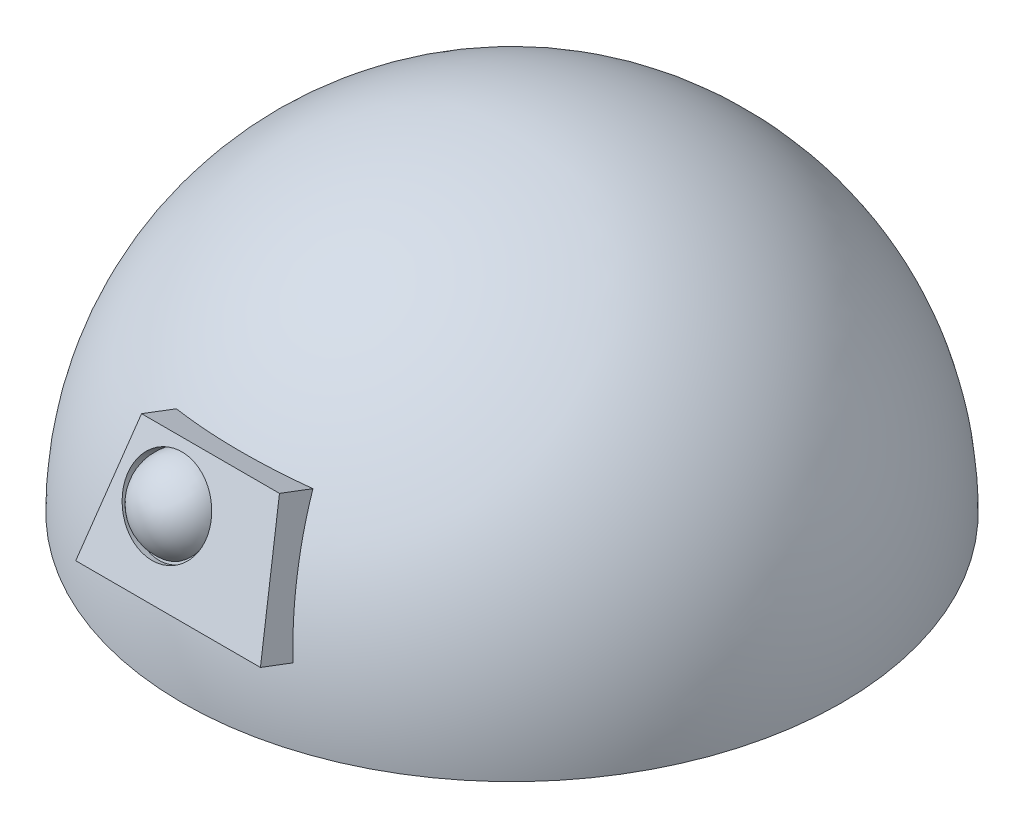
ISO-10303-21;
HEADER;
FILE_DESCRIPTION(('STEP AP214'),'2;1');
FILE_NAME('part.step','',(''),(''),'','','');
FILE_SCHEMA(('AUTOMOTIVE_DESIGN { 1 0 10303 214 1 1 1 1 }'));
ENDSEC;
DATA;
#1=APPLICATION_CONTEXT('core data for automotive mechanical design processes');
#2=APPLICATION_PROTOCOL_DEFINITION('international standard','automotive_design',2000,#1);
#3=PRODUCT_CONTEXT('',#1,'mechanical');
#4=PRODUCT('Part','Part','',(#3));
#5=PRODUCT_RELATED_PRODUCT_CATEGORY('part','',(#4));
#6=PRODUCT_DEFINITION_FORMATION('','',#4);
#7=PRODUCT_DEFINITION_CONTEXT('part definition',#1,'design');
#8=PRODUCT_DEFINITION('design','',#6,#7);
#9=PRODUCT_DEFINITION_SHAPE('','',#8);
#10=(LENGTH_UNIT() NAMED_UNIT(*) SI_UNIT(.MILLI.,.METRE.));
#11=(NAMED_UNIT(*) PLANE_ANGLE_UNIT() SI_UNIT($,.RADIAN.));
#12=(NAMED_UNIT(*) SI_UNIT($,.STERADIAN.) SOLID_ANGLE_UNIT());
#13=UNCERTAINTY_MEASURE_WITH_UNIT(LENGTH_MEASURE(1.E-05),#10,'distance_accuracy_value','');
#14=(GEOMETRIC_REPRESENTATION_CONTEXT(3) GLOBAL_UNCERTAINTY_ASSIGNED_CONTEXT((#13)) GLOBAL_UNIT_ASSIGNED_CONTEXT((#10,
#11,#12)) REPRESENTATION_CONTEXT('',''));
#15=CARTESIAN_POINT('',(0.,0.,0.));
#16=DIRECTION('',(0.,0.,1.));
#17=DIRECTION('',(1.,0.,0.));
#18=AXIS2_PLACEMENT_3D('',#15,#16,#17);
#19=CARTESIAN_POINT('',(93.2238359222801,259.835287103337,172.836450809138));
#20=DIRECTION('',(-0.468579118998303,0.826360704640854,-0.312348515386651));
#21=DIRECTION('',(0.883421102676732,0.438663000991985,-0.164748071024012));
#22=AXIS2_PLACEMENT_3D('',#19,#20,#21);
#23=SPHERICAL_SURFACE('',#22,11.3046302669509);
#24=CARTESIAN_POINT('',(93.2238359222801,259.835287103337,172.836450809138));
#25=DIRECTION('',(0.000874405055275862,-0.353132775859417,-0.935572807444521));
#26=DIRECTION('',(0.827905680495407,-0.524476362863778,0.198737839881135));
#27=AXIS2_PLACEMENT_3D('',#24,#25,#26);
#28=SPHERICAL_SURFACE('',#27,11.3046302669509);
#29=CARTESIAN_POINT('',(93.2238359222801,259.835287103337,172.836450809138));
#30=DIRECTION('',(0.000874405055275862,-0.353132775859417,-0.935572807444521));
#31=DIRECTION('',(0.827905680495407,-0.524476362863778,0.198737839881135));
#32=AXIS2_PLACEMENT_3D('',#29,#30,#31);
#33=CIRCLE('',#32,11.3046302669509);
#34=CARTESIAN_POINT('',(102.583003536189,253.906275737407,175.083108609046));
#35=VERTEX_POINT('',#34);
#36=EDGE_CURVE('E12',#35,#35,#33,.T.);
#37=ORIENTED_EDGE('',*,*,#36,.F.);
#38=EDGE_LOOP('',(#37));
#39=FACE_BOUND('',#38,.T.);
#40=ADVANCED_FACE('F43',(#39),#28,.T.);
#41=CARTESIAN_POINT('',(93.2238359222801,259.835287103337,172.836450809138));
#42=DIRECTION('',(0.000874405055275862,-0.353132775859417,-0.935572807444521));
#43=DIRECTION('',(0.827905680495407,-0.524476362863778,0.198737839881135));
#44=AXIS2_PLACEMENT_3D('',#41,#42,#43);
#45=PLANE('',#44);
#46=ORIENTED_EDGE('',*,*,#36,.T.);
#47=EDGE_LOOP('',(#46));
#48=FACE_BOUND('',#47,.T.);
#49=ADVANCED_FACE('F50',(#48),#45,.T.);
#50=CLOSED_SHELL('',(#40,#49));
#51=MANIFOLD_SOLID_BREP('B2',#50);
#52=CARTESIAN_POINT('',(100.909927582886,221.719877511256,93.0506266256161));
#53=DIRECTION('',(0.00253055097969708,0.,-0.999996798150744));
#54=DIRECTION('',(-0.999996798150744,0.,-0.00253055097969708));
#55=AXIS2_PLACEMENT_3D('',#52,#53,#54);
#56=SPHERICAL_SURFACE('',#55,88.1119686753254);
#57=CARTESIAN_POINT('',(78.4925954001065,225.411072234313,91.6364302564517));
#58=DIRECTION('',(-0.984807376527911,0.16215648507274,-0.0621265280300407));
#59=DIRECTION('',(-0.16247033202055,-0.986713429123741,0.));
#60=AXIS2_PLACEMENT_3D('',#57,#58,#59);
#61=CIRCLE('',#60,85.1208398207771);
#62=CARTESIAN_POINT('',(75.6448384490089,240.212805467445,175.412061232512));
#63=VERTEX_POINT('',#62);
#64=CARTESIAN_POINT('',(81.5058743394977,271.182905571055,163.3401037664));
#65=VERTEX_POINT('',#64);
#66=EDGE_CURVE('E91',#63,#65,#61,.T.);
#67=ORIENTED_EDGE('',*,*,#66,.T.);
#68=CARTESIAN_POINT('',(100.909927582886,241.792369666429,85.4742468754032));
#69=DIRECTION('',(0.,0.935573165106818,-0.353132910859368));
#70=DIRECTION('',(0.,0.353132910859368,0.935573165106819));
#71=AXIS2_PLACEMENT_3D('',#68,#69,#70);
#72=CIRCLE('',#71,85.4600055722127);
#73=CARTESIAN_POINT('',(118.39746546765,271.332520378528,163.736485963216));
#74=VERTEX_POINT('',#73);
#75=EDGE_CURVE('E129',#65,#74,#72,.T.);
#76=ORIENTED_EDGE('',*,*,#75,.T.);
#77=CARTESIAN_POINT('',(121.923567848481,225.662195528681,91.5822350043501));
#78=DIRECTION('',(0.980543180600844,0.18395732480842,-0.0685184181553335));
#79=DIRECTION('',(-0.1843906702493,0.982853031091126,0.));
#80=AXIS2_PLACEMENT_3D('',#77,#78,#79);
#81=CIRCLE('',#80,85.4660628631374);
#82=CARTESIAN_POINT('',(125.051335900975,240.329847948912,175.722147892437));
#83=VERTEX_POINT('',#82);
#84=EDGE_CURVE('E160',#74,#83,#81,.T.);
#85=ORIENTED_EDGE('',*,*,#84,.T.);
#86=CARTESIAN_POINT('',(100.909927582886,210.695975865551,97.2116079602303));
#87=DIRECTION('',(0.,-0.935573165106818,0.353132910859368));
#88=DIRECTION('',(0.,-0.353132910859368,-0.935573165106819));
#89=AXIS2_PLACEMENT_3D('',#86,#87,#88);
#90=CIRCLE('',#89,87.320552281123);
#91=EDGE_CURVE('E87',#83,#63,#90,.T.);
#92=ORIENTED_EDGE('',*,*,#91,.T.);
#93=EDGE_LOOP('',(#67,#76,#85,#92));
#94=FACE_BOUND('',#93,.T.);
#95=CARTESIAN_POINT('',(100.909927582886,221.719877511256,93.0506266256161));
#96=DIRECTION('',(0.,1.,0.));
#97=DIRECTION('',(0.00506108575450862,0.,-0.999987192623478));
#98=AXIS2_PLACEMENT_3D('',#95,#96,#97);
#99=CIRCLE('',#98,88.1119686753254);
#100=CARTESIAN_POINT('',(101.35586981235,221.719877511256,4.93978643344956));
#101=VERTEX_POINT('',#100);
#102=EDGE_CURVE('E41',#101,#101,#99,.T.);
#103=ORIENTED_EDGE('',*,*,#102,.T.);
#104=EDGE_LOOP('',(#103));
#105=FACE_BOUND('',#104,.T.);
#106=ADVANCED_FACE('F73',(#94,#105),#56,.T.);
#107=CARTESIAN_POINT('',(100.909927582886,221.719877511256,93.0506266256161));
#108=DIRECTION('',(0.,1.,0.));
#109=DIRECTION('',(0.00506108575450862,0.,-0.999987192623478));
#110=AXIS2_PLACEMENT_3D('',#107,#108,#109);
#111=PLANE('',#110);
#112=DIRECTION('',(-0.00253055097969693,0.,0.999996798150744));
#113=VECTOR('',#112,1.);
#114=CARTESIAN_POINT('',(95.8299438482799,221.719877511256,93.0377714266393));
#115=LINE('',#114,#113);
#116=CARTESIAN_POINT('',(96.0396668606708,221.719877511256,10.1616141897216));
#117=VERTEX_POINT('',#116);
#118=CARTESIAN_POINT('',(95.620220835889,221.719877511256,175.913928663557));
#119=VERTEX_POINT('',#118);
#120=EDGE_CURVE('E178',#117,#119,#115,.T.);
#121=ORIENTED_EDGE('',*,*,#120,.F.);
#122=CARTESIAN_POINT('',(100.909927582886,221.719877511256,93.0506266256161));
#123=DIRECTION('',(0.,1.,0.));
#124=DIRECTION('',(0.999987192623478,0.,0.00506108575450862));
#125=AXIS2_PLACEMENT_3D('',#122,#123,#124);
#126=CIRCLE('',#125,83.0319686753254);
#127=EDGE_CURVE('E175',#117,#119,#126,.T.);
#128=ORIENTED_EDGE('',*,*,#127,.T.);
#129=EDGE_LOOP('',(#121,#128));
#130=FACE_BOUND('',#129,.T.);
#131=ORIENTED_EDGE('',*,*,#102,.F.);
#132=EDGE_LOOP('',(#131));
#133=FACE_BOUND('',#132,.T.);
#134=CARTESIAN_POINT('',(100.909927582886,221.719877511256,93.0506266256161));
#135=DIRECTION('',(0.,-1.,0.));
#136=DIRECTION('',(-1.,0.,0.));
#137=AXIS2_PLACEMENT_3D('',#134,#135,#136);
#138=CIRCLE('',#137,83.0319686753254);
#139=CARTESIAN_POINT('',(106.199634329882,221.719877511256,10.1873245876753));
#140=VERTEX_POINT('',#139);
#141=CARTESIAN_POINT('',(105.780188305101,221.719877511256,175.939639061511));
#142=VERTEX_POINT('',#141);
#143=EDGE_CURVE('E167',#140,#142,#138,.T.);
#144=ORIENTED_EDGE('',*,*,#143,.F.);
#145=DIRECTION('',(-0.00253055097969724,0.,0.999996798150744));
#146=VECTOR('',#145,1.);
#147=CARTESIAN_POINT('',(105.989911317491,221.719877511256,93.063481824593));
#148=LINE('',#147,#146);
#149=EDGE_CURVE('E172',#140,#142,#148,.T.);
#150=ORIENTED_EDGE('',*,*,#149,.T.);
#151=EDGE_LOOP('',(#144,#150));
#152=FACE_BOUND('',#151,.T.);
#153=ADVANCED_FACE('F191',(#130,#133,#152),#111,.F.);
#154=CARTESIAN_POINT('',(100.909927582886,221.719877511256,93.0506266256161));
#155=DIRECTION('',(0.00253055097969708,0.,-0.999996798150744));
#156=DIRECTION('',(-0.999996798150744,0.,-0.00253055097969708));
#157=AXIS2_PLACEMENT_3D('',#154,#155,#156);
#158=SPHERICAL_SURFACE('',#157,83.0319686753254);
#159=CARTESIAN_POINT('',(100.700204570495,221.719877511256,175.926783862534));
#160=DIRECTION('',(0.00253055097969708,0.,-0.999996798150744));
#161=DIRECTION('',(-0.999996798150744,0.,-0.00253055097969708));
#162=AXIS2_PLACEMENT_3D('',#159,#160,#161);
#163=CIRCLE('',#162,5.07999999999996);
#164=EDGE_CURVE('E80',#119,#142,#163,.T.);
#165=ORIENTED_EDGE('',*,*,#164,.F.);
#166=ORIENTED_EDGE('',*,*,#127,.F.);
#167=CARTESIAN_POINT('',(101.119650595277,221.719877511256,10.1744693886984));
#168=DIRECTION('',(0.00253055097969708,0.,-0.999996798150744));
#169=DIRECTION('',(-0.999996798150744,0.,-0.00253055097969708));
#170=AXIS2_PLACEMENT_3D('',#167,#168,#169);
#171=CIRCLE('',#170,5.08000000000001);
#172=EDGE_CURVE('E181',#117,#140,#171,.T.);
#173=ORIENTED_EDGE('',*,*,#172,.T.);
#174=ORIENTED_EDGE('',*,*,#143,.T.);
#175=EDGE_LOOP('',(#165,#166,#173,#174));
#176=FACE_BOUND('',#175,.T.);
#177=ADVANCED_FACE('F192',(#176),#158,.F.);
#178=CARTESIAN_POINT('',(101.13289941154,221.719877511256,4.93894007153205));
#179=DIRECTION('',(0.00253055097969708,0.,-0.999996798150744));
#180=DIRECTION('',(-0.999996798150744,0.,-0.00253055097969708));
#181=AXIS2_PLACEMENT_3D('',#178,#179,#180);
#182=CYLINDRICAL_SURFACE('',#181,5.07999999999998);
#183=ORIENTED_EDGE('',*,*,#120,.T.);
#184=ORIENTED_EDGE('',*,*,#164,.T.);
#185=ORIENTED_EDGE('',*,*,#149,.F.);
#186=ORIENTED_EDGE('',*,*,#172,.F.);
#187=EDGE_LOOP('',(#183,#184,#185,#186));
#188=FACE_BOUND('',#187,.T.);
#189=ADVANCED_FACE('F185',(#188),#182,.T.);
#190=CARTESIAN_POINT('',(81.6507476094789,212.675124002329,8.33243186059365));
#191=DIRECTION('',(-0.984807376527911,0.16215648507274,-0.0621265280300407));
#192=DIRECTION('',(-0.16247033202055,-0.986713429123741,0.));
#193=AXIS2_PLACEMENT_3D('',#190,#191,#192);
#194=PLANE('',#193);
#195=ORIENTED_EDGE('',*,*,#66,.F.);
#196=DIRECTION('',(-0.000874405055269395,0.35313277585942,0.93557280744452));
#197=VECTOR('',#196,1.);
#198=CARTESIAN_POINT('',(75.7900289204756,181.576920520995,20.0649984660059));
#199=LINE('',#198,#197);
#200=CARTESIAN_POINT('',(75.6364578893631,243.597335638154,184.378870914748));
#201=VERTEX_POINT('',#200);
#202=EDGE_CURVE('E131',#63,#201,#199,.T.);
#203=ORIENTED_EDGE('',*,*,#202,.T.);
#204=DIRECTION('',(-0.173648111282595,-0.921413325800466,0.347625972109842));
#205=VECTOR('',#204,1.);
#206=CARTESIAN_POINT('',(81.4971765783664,274.695539119488,172.646304309335));
#207=LINE('',#206,#205);
#208=CARTESIAN_POINT('',(81.4971765783664,274.695539119488,172.646304309335));
#209=VERTEX_POINT('',#208);
#210=EDGE_CURVE('E134',#209,#201,#207,.T.);
#211=ORIENTED_EDGE('',*,*,#210,.F.);
#212=DIRECTION('',(-0.000874405055269395,0.35313277585942,0.93557280744452));
#213=VECTOR('',#212,1.);
#214=CARTESIAN_POINT('',(81.6507476094789,212.675124002329,8.33243186059365));
#215=LINE('',#214,#213);
#216=EDGE_CURVE('E123',#65,#209,#215,.T.);
#217=ORIENTED_EDGE('',*,*,#216,.F.);
#218=EDGE_LOOP('',(#195,#203,#211,#217));
#219=FACE_BOUND('',#218,.T.);
#220=ADVANCED_FACE('F135',(#219),#194,.T.);
#221=CARTESIAN_POINT('',(75.7900289204756,181.576920520995,20.0649984660059));
#222=DIRECTION('',(0.,-0.935573165106818,0.353132910859368));
#223=DIRECTION('',(0.,-0.353132910859368,-0.935573165106819));
#224=AXIS2_PLACEMENT_3D('',#221,#222,#223);
#225=PLANE('',#224);
#226=ORIENTED_EDGE('',*,*,#91,.F.);
#227=DIRECTION('',(-0.000874405055269395,0.35313277585942,0.93557280744452));
#228=VECTOR('',#227,1.);
#229=CARTESIAN_POINT('',(125.196778409986,181.592176402343,20.1054166563258));
#230=LINE('',#229,#228);
#231=CARTESIAN_POINT('',(125.043207378874,243.612591519502,184.419289105067));
#232=VERTEX_POINT('',#231);
#233=EDGE_CURVE('E168',#83,#232,#230,.T.);
#234=ORIENTED_EDGE('',*,*,#233,.T.);
#235=DIRECTION('',(0.999999617707827,0.000308781202437377,0.000818069905143393));
#236=VECTOR('',#235,1.);
#237=CARTESIAN_POINT('',(75.6364578893631,243.597335638154,184.378870914748));
#238=LINE('',#237,#236);
#239=EDGE_CURVE('E140',#201,#232,#238,.T.);
#240=ORIENTED_EDGE('',*,*,#239,.F.);
#241=ORIENTED_EDGE('',*,*,#202,.F.);
#242=EDGE_LOOP('',(#226,#234,#240,#241));
#243=FACE_BOUND('',#242,.T.);
#244=ADVANCED_FACE('F224',(#243),#225,.T.);
#245=CARTESIAN_POINT('',(118.542680997348,212.686515542236,8.36261205257849));
#246=DIRECTION('',(0.,0.935573165106818,-0.353132910859368));
#247=DIRECTION('',(0.,0.353132910859368,0.935573165106819));
#248=AXIS2_PLACEMENT_3D('',#245,#246,#247);
#249=PLANE('',#248);
#250=ORIENTED_EDGE('',*,*,#75,.F.);
#251=ORIENTED_EDGE('',*,*,#216,.T.);
#252=DIRECTION('',(-0.999999617707827,-0.000308781202437493,-0.000818069905143769));
#253=VECTOR('',#252,1.);
#254=CARTESIAN_POINT('',(118.389109966235,274.706930659395,172.67648450132));
#255=LINE('',#254,#253);
#256=CARTESIAN_POINT('',(118.389109966235,274.706930659395,172.67648450132));
#257=VERTEX_POINT('',#256);
#258=EDGE_CURVE('E128',#257,#209,#255,.T.);
#259=ORIENTED_EDGE('',*,*,#258,.F.);
#260=DIRECTION('',(-0.000874405055269395,0.35313277585942,0.93557280744452));
#261=VECTOR('',#260,1.);
#262=CARTESIAN_POINT('',(118.542680997348,212.686515542236,8.36261205257849));
#263=LINE('',#262,#261);
#264=EDGE_CURVE('E165',#74,#257,#263,.T.);
#265=ORIENTED_EDGE('',*,*,#264,.F.);
#266=EDGE_LOOP('',(#250,#251,#259,#265));
#267=FACE_BOUND('',#266,.T.);
#268=ADVANCED_FACE('F125',(#267),#249,.T.);
#269=CARTESIAN_POINT('',(118.542680997348,212.686515542236,8.36261205257849));
#270=DIRECTION('',(0.980543180600844,0.18395732480842,-0.0685184181553335));
#271=DIRECTION('',(-0.1843906702493,0.982853031091126,0.));
#272=AXIS2_PLACEMENT_3D('',#269,#270,#271);
#273=PLANE('',#272);
#274=ORIENTED_EDGE('',*,*,#84,.F.);
#275=ORIENTED_EDGE('',*,*,#264,.T.);
#276=DIRECTION('',(-0.196301570021686,0.917309623444097,-0.346422788430367));
#277=VECTOR('',#276,1.);
#278=CARTESIAN_POINT('',(118.389109966235,274.706930659395,172.67648450132));
#279=LINE('',#278,#277);
#280=EDGE_CURVE('E145',#232,#257,#279,.T.);
#281=ORIENTED_EDGE('',*,*,#280,.F.);
#282=ORIENTED_EDGE('',*,*,#233,.F.);
#283=EDGE_LOOP('',(#274,#275,#281,#282));
#284=FACE_BOUND('',#283,.T.);
#285=ADVANCED_FACE('F219',(#284),#273,.T.);
#286=CARTESIAN_POINT('',(-0.225995166789628,91.2692579923914,241.804334716618));
#287=DIRECTION('',(-0.000874405055269399,0.35313277585942,0.935572807444519));
#288=DIRECTION('',(0.,-0.935573165106818,0.353132910859368));
#289=AXIS2_PLACEMENT_3D('',#286,#287,#288);
#290=PLANE('',#289);
#291=CARTESIAN_POINT('',(93.2193939445993,261.629201604703,177.589160670956));
#292=DIRECTION('',(-0.000874405055269399,0.35313277585942,0.93557280744452));
#293=DIRECTION('',(0.,-0.935573165106818,0.353132910859368));
#294=AXIS2_PLACEMENT_3D('',#291,#292,#293);
#295=CIRCLE('',#294,11.304630266951);
#296=CARTESIAN_POINT('',(93.2193939445993,251.052892885489,181.581197663313));
#297=VERTEX_POINT('',#296);
#298=EDGE_CURVE('E149',#297,#297,#295,.T.);
#299=ORIENTED_EDGE('',*,*,#298,.F.);
#300=EDGE_LOOP('',(#299));
#301=FACE_BOUND('',#300,.T.);
#302=ORIENTED_EDGE('',*,*,#258,.T.);
#303=ORIENTED_EDGE('',*,*,#210,.T.);
#304=ORIENTED_EDGE('',*,*,#239,.T.);
#305=ORIENTED_EDGE('',*,*,#280,.T.);
#306=EDGE_LOOP('',(#302,#303,#304,#305));
#307=FACE_BOUND('',#306,.T.);
#308=ADVANCED_FACE('F143',(#301,#307),#290,.T.);
#309=CARTESIAN_POINT('',(93.3806593894588,196.501359707778,5.04262279148865));
#310=DIRECTION('',(-0.000874405055269399,0.35313277585942,0.93557280744452));
#311=DIRECTION('',(0.,-0.935573165106818,0.353132910859368));
#312=AXIS2_PLACEMENT_3D('',#309,#310,#311);
#313=CYLINDRICAL_SURFACE('',#312,11.304630266951);
#314=CARTESIAN_POINT('',(87.0943830383703,251.918329403161,178.764292732126));
#315=CARTESIAN_POINT('',(86.8257058119326,252.067393116342,178.668469141934));
#316=CARTESIAN_POINT('',(86.5644496373193,252.226975445202,178.568321634296));
#317=CARTESIAN_POINT('',(86.0584765307588,252.566111535676,178.360040985748));
#318=CARTESIAN_POINT('',(85.8137640807394,252.745670674709,178.251905697307));
#319=CARTESIAN_POINT('',(85.3424474642953,253.123644491842,178.028324753989));
#320=CARTESIAN_POINT('',(85.1158636561767,253.322079835408,177.912871134291));
#321=CARTESIAN_POINT('',(84.6827120260316,253.736228189358,177.67558126411));
#322=CARTESIAN_POINT('',(84.476144129029,253.951941135016,177.553745037537));
#323=CARTESIAN_POINT('',(84.0845889462702,254.399013355313,177.304612603499));
#324=CARTESIAN_POINT('',(83.8995918726336,254.630365457722,177.177318908535));
#325=CARTESIAN_POINT('',(83.5523942082317,255.107171583689,176.918121666337));
#326=CARTESIAN_POINT('',(83.3901939920416,255.352625838866,176.786218043402));
#327=CARTESIAN_POINT('',(83.0898082391681,255.855830226351,176.518776954836));
#328=CARTESIAN_POINT('',(82.9516163633542,256.113577089957,176.383240459368));
#329=CARTESIAN_POINT('',(82.7002075824376,256.639601300223,176.109467378081));
#330=CARTESIAN_POINT('',(82.5869905438136,256.907878590575,175.971230806703));
#331=CARTESIAN_POINT('',(82.386483948031,257.452760225231,175.693200035219));
#332=CARTESIAN_POINT('',(82.2991659192444,257.729355054462,175.553407722183));
#333=CARTESIAN_POINT('',(82.1509530609851,258.289189144264,175.273118270454));
#334=CARTESIAN_POINT('',(82.0900582579672,258.572428411487,175.132621131057));
#335=CARTESIAN_POINT('',(81.9951714677644,259.143537125814,174.851931742354));
#336=CARTESIAN_POINT('',(81.9611801667564,259.431406690823,174.711739500917));
#337=CARTESIAN_POINT('',(81.9203948324137,260.009703897749,174.432680275977));
#338=CARTESIAN_POINT('',(81.9136006745227,260.300131527944,174.293813286408));
#339=CARTESIAN_POINT('',(81.9272699705712,260.879894675477,174.019154323072));
#340=CARTESIAN_POINT('',(81.9475877249551,261.169227717974,173.883349868845));
#341=CARTESIAN_POINT('',(82.0151276973164,261.746279028057,173.615038298144));
#342=CARTESIAN_POINT('',(82.0623498376441,262.033997300301,173.482531172154));
#343=CARTESIAN_POINT('',(82.1834022392296,262.605736226846,173.221784220164));
#344=CARTESIAN_POINT('',(82.2572316664259,262.889756996764,173.093544260536));
#345=CARTESIAN_POINT('',(82.4310075592613,263.452052294176,172.842266569292));
#346=CARTESIAN_POINT('',(82.5309539028952,263.730326848506,172.719228813376));
#347=CARTESIAN_POINT('',(82.7555003624078,264.277216744339,172.480085583757));
#348=CARTESIAN_POINT('',(82.8799261641454,264.545885361492,172.363938246858));
#349=CARTESIAN_POINT('',(83.1529966163242,265.073624193325,172.138510327496));
#350=CARTESIAN_POINT('',(83.3016411578622,265.332694451159,172.029229714159));
#351=CARTESIAN_POINT('',(83.6221003442555,265.83935953687,171.81833338522));
#352=CARTESIAN_POINT('',(83.7939143160067,266.086954697834,171.716717447083));
#353=CARTESIAN_POINT('',(84.1594958091076,266.568887915736,171.521886284059));
#354=CARTESIAN_POINT('',(84.353263269582,266.803226009431,171.428671035878));
#355=CARTESIAN_POINT('',(84.7602818045842,267.255747386,171.251788513927));
#356=CARTESIAN_POINT('',(84.9734240994644,267.474009753505,171.168073225073));
#357=CARTESIAN_POINT('',(85.4185398503722,267.894183274818,171.010222668963));
#358=CARTESIAN_POINT('',(85.6505132307343,268.096094494322,170.936087363216));
#359=CARTESIAN_POINT('',(86.1316312822155,268.482126571568,170.797923953551));
#360=CARTESIAN_POINT('',(86.3807757446659,268.666247645436,170.733895726841));
#361=CARTESIAN_POINT('',(86.894455635446,269.015398270805,170.616395377456));
#362=CARTESIAN_POINT('',(87.1589910690931,269.180427815709,170.562923258429));
#363=CARTESIAN_POINT('',(87.7012058850408,269.490032813821,170.466967886057));
#364=CARTESIAN_POINT('',(87.9788677306143,269.63463458211,170.424470435571));
#365=CARTESIAN_POINT('',(88.5456727325119,269.902633074735,170.350660442689));
#366=CARTESIAN_POINT('',(88.8348158695271,270.026029834731,170.319347881484));
#367=CARTESIAN_POINT('',(89.4225283424288,270.250772046339,170.268111014402));
#368=CARTESIAN_POINT('',(89.7210977324659,270.352117371246,170.24818677396));
#369=CARTESIAN_POINT('',(90.3255446158457,270.53207185298,170.219846411641));
#370=CARTESIAN_POINT('',(90.6314221322548,270.610680938034,170.211430326091));
#371=CARTESIAN_POINT('',(91.2493355292944,270.744863898145,170.206133785458));
#372=CARTESIAN_POINT('',(91.5613882922281,270.800361521562,170.209291184178));
#373=CARTESIAN_POINT('',(92.1884679197487,270.887596010576,170.227178858394));
#374=CARTESIAN_POINT('',(92.5034947884559,270.919332843249,170.241909149925));
#375=CARTESIAN_POINT('',(93.1343128370637,270.958862759223,170.282813997417));
#376=CARTESIAN_POINT('',(93.4501040338268,270.96665530936,170.308988808196));
#377=CARTESIAN_POINT('',(94.080233777858,270.958280600707,170.37257412032));
#378=CARTESIAN_POINT('',(94.3945723186187,270.942113234693,170.409984671947));
#379=CARTESIAN_POINT('',(95.021589220868,270.8857917887,170.49602828787));
#380=CARTESIAN_POINT('',(95.3342444397143,270.845486358309,170.544730965035));
#381=CARTESIAN_POINT('',(95.9536724428079,270.741084675727,170.652860358346));
#382=CARTESIAN_POINT('',(96.2604452048832,270.676988333881,170.712287114904));
#383=CARTESIAN_POINT('',(96.8659731136127,270.525485855014,170.841428960523));
#384=CARTESIAN_POINT('',(97.1647280336632,270.438079059946,170.911144340005));
#385=CARTESIAN_POINT('',(97.752131733262,270.240596884486,171.060356915958));
#386=CARTESIAN_POINT('',(98.0407804738982,270.130521416823,171.139854150088));
#387=CARTESIAN_POINT('',(98.6078224784681,269.887698922066,171.308613635406));
#388=CARTESIAN_POINT('',(98.8861360547606,269.754807921422,171.397936517917));
#389=CARTESIAN_POINT('',(99.4285388416116,269.467816377347,171.585275431818));
#390=CARTESIAN_POINT('',(99.692627988737,269.313715739345,171.68329150197));
#391=CARTESIAN_POINT('',(100.204733013613,268.985399547679,171.887320951381));
#392=CARTESIAN_POINT('',(100.452748532884,268.811183545638,171.99333450889));
#393=CARTESIAN_POINT('',(100.930956655818,268.443872614224,172.212606675046));
#394=CARTESIAN_POINT('',(101.161149231493,268.250777655207,172.325865295071));
#395=CARTESIAN_POINT('',(101.602950371092,267.846280651548,172.559284660728));
#396=CARTESIAN_POINT('',(101.814482900306,267.63481010022,172.679470618475));
#397=CARTESIAN_POINT('',(102.21644198108,267.195710487972,172.925489300107));
#398=CARTESIAN_POINT('',(102.406868464798,266.968081375117,173.05132204214));
#399=CARTESIAN_POINT('',(102.765249270815,266.498273850786,173.307745036174));
#400=CARTESIAN_POINT('',(102.9332034517,266.256095347766,173.438335318106));
#401=CARTESIAN_POINT('',(103.245422135618,265.75890470507,173.703348846679));
#402=CARTESIAN_POINT('',(103.389686672822,265.503892583906,173.837772087789));
#403=CARTESIAN_POINT('',(103.653415396509,264.982950865291,174.109443080414));
#404=CARTESIAN_POINT('',(103.772889884418,264.717025857901,174.246689632545));
#405=CARTESIAN_POINT('',(103.986227303237,264.176047664172,174.523088000758));
#406=CARTESIAN_POINT('',(104.080090218972,263.900994472424,174.662239817968));
#407=CARTESIAN_POINT('',(104.241492096572,263.34372455513,174.941456391731));
#408=CARTESIAN_POINT('',(104.309031375507,263.061507915912,175.081521137266));
#409=CARTESIAN_POINT('',(104.41725876568,262.491929375519,175.361563796474));
#410=CARTESIAN_POINT('',(104.457946981041,262.2045674943,175.501541710482));
#411=CARTESIAN_POINT('',(104.512011599873,261.628062111347,175.779780072276));
#412=CARTESIAN_POINT('',(104.525509636106,261.338932373692,175.918045406486));
#413=CARTESIAN_POINT('',(104.525415133742,260.759694859141,176.192505040939));
#414=CARTESIAN_POINT('',(104.511822656694,260.469587084467,176.328699345886));
#415=CARTESIAN_POINT('',(104.457598949206,259.890491339185,176.598034119937));
#416=CARTESIAN_POINT('',(104.416968442685,259.601503338804,176.731174670705));
#417=CARTESIAN_POINT('',(104.308917782226,259.026732215584,176.993443392569));
#418=CARTESIAN_POINT('',(104.241497751473,258.740949078013,177.122571582113));
#419=CARTESIAN_POINT('',(104.080842672824,258.176518729299,177.37504954664));
#420=CARTESIAN_POINT('',(103.987779295986,257.897837078049,177.498431582877));
#421=CARTESIAN_POINT('',(103.776284992283,257.347696787512,177.73942268435));
#422=CARTESIAN_POINT('',(103.657854169864,257.076238118491,177.857031773353));
#423=CARTESIAN_POINT('',(103.396449164249,256.542513132729,178.085624975386));
#424=CARTESIAN_POINT('',(103.253475611282,256.280246580153,178.196609258435));
#425=CARTESIAN_POINT('',(102.943988979106,255.766799368489,178.411152572663));
#426=CARTESIAN_POINT('',(102.777475976964,255.515618673108,178.51471162815));
#427=CARTESIAN_POINT('',(102.423116276737,255.027571789728,178.713082150164));
#428=CARTESIAN_POINT('',(102.235397569381,254.790631688108,178.807940431798));
#429=CARTESIAN_POINT('',(101.839192199279,254.331211271829,178.988894581585));
#430=CARTESIAN_POINT('',(101.630705622499,254.108730897323,179.074990486005));
#431=CARTESIAN_POINT('',(101.194453496894,253.679825951998,179.237802357108));
#432=CARTESIAN_POINT('',(100.966688235883,253.473401141573,179.314518463779));
#433=CARTESIAN_POINT('',(100.493505404552,253.078077358817,179.458024537173));
#434=CARTESIAN_POINT('',(100.248087845071,252.889178375727,179.524814509989));
#435=CARTESIAN_POINT('',(99.7419896338446,252.530694532012,179.647840774492));
#436=CARTESIAN_POINT('',(99.4813483815614,252.361062892268,179.704102851831));
#437=CARTESIAN_POINT('',(98.9461130645954,252.041765935572,179.805883160037));
#438=CARTESIAN_POINT('',(98.6715190302503,251.892100575209,179.851401414264));
#439=CARTESIAN_POINT('',(98.1103477478688,251.61378338286,179.931376842632));
#440=CARTESIAN_POINT('',(97.8237709759111,251.485130717026,179.965834455745));
#441=CARTESIAN_POINT('',(97.2406641497939,251.249716589488,180.023456428058));
#442=CARTESIAN_POINT('',(96.9441340837333,251.142955153959,180.046620773754));
#443=CARTESIAN_POINT('',(96.342727097388,250.951887947977,180.081532573172));
#444=CARTESIAN_POINT('',(96.0378371458049,250.867619725314,180.093261022512));
#445=CARTESIAN_POINT('',(95.4223459539761,250.722331713943,180.105163808189));
#446=CARTESIAN_POINT('',(95.1117446893673,250.661312024433,180.105338095226));
#447=CARTESIAN_POINT('',(94.4869419721005,250.562898372616,180.094143343813));
#448=CARTESIAN_POINT('',(94.1727395680824,250.52551080716,180.082771182087));
#449=CARTESIAN_POINT('',(93.5430326104847,250.474608306661,180.048573229723));
#450=CARTESIAN_POINT('',(93.2275280721595,250.461093092745,180.025747572886));
#451=CARTESIAN_POINT('',(92.5956059742574,250.457977407119,179.968652494334));
#452=CARTESIAN_POINT('',(92.2791936112167,250.468515025262,179.93431796375));
#453=CARTESIAN_POINT('',(91.6495094807649,250.513672211245,179.854495213306));
#454=CARTESIAN_POINT('',(91.3362377463865,250.54829203211,179.809006876259));
#455=CARTESIAN_POINT('',(90.7153525211849,250.641282840219,179.707261039068));
#456=CARTESIAN_POINT('',(90.407733466352,250.699629001845,179.651014827711));
#457=CARTESIAN_POINT('',(89.8000610196381,250.839597607818,179.528150171553));
#458=CARTESIAN_POINT('',(89.500005703232,250.921214064836,179.461534396788));
#459=CARTESIAN_POINT('',(88.8354922553483,251.130423053891,179.300460886786));
#460=CARTESIAN_POINT('',(88.4737027249862,251.264409529184,179.203207160622));
#461=CARTESIAN_POINT('',(87.7689675489983,251.566365037712,178.994262526785));
#462=CARTESIAN_POINT('',(87.4260219584338,251.734334170236,178.88257157693));
#463=CARTESIAN_POINT('',(87.0943830383703,251.918329403161,178.764292732126));
#464=B_SPLINE_CURVE_WITH_KNOTS('',3,(#314,#315,#316,#317,#318,#319,#320,#321,#322,#323,#324,
#325,#326,#327,#328,#329,#330,#331,#332,#333,#334,#335,#336,#337,#338,#339,#340,#341,#342,#343,
#344,#345,#346,#347,#348,#349,#350,#351,#352,#353,#354,#355,#356,#357,#358,#359,#360,#361,#362,
#363,#364,#365,#366,#367,#368,#369,#370,#371,#372,#373,#374,#375,#376,#377,#378,#379,#380,#381,
#382,#383,#384,#385,#386,#387,#388,#389,#390,#391,#392,#393,#394,#395,#396,#397,#398,#399,#400,
#401,#402,#403,#404,#405,#406,#407,#408,#409,#410,#411,#412,#413,#414,#415,#416,#417,#418,#419,
#420,#421,#422,#423,#424,#425,#426,#427,#428,#429,#430,#431,#432,#433,#434,#435,#436,#437,#438,
#439,#440,#441,#442,#443,#444,#445,#446,#447,#448,#449,#450,#451,#452,#453,#454,#455,#456,#457,
#458,#459,#460,#461,#462,#463),.UNSPECIFIED.,.T.,.F.,(4,2,2,2,2,2,2,2,2,2,2,2,2,2,2,2,2,2,2,2,2,
2,2,2,2,2,2,2,2,2,2,2,2,2,2,2,2,2,2,2,2,2,2,2,2,2,2,2,2,2,2,2,2,2,2,2,2,2,2,2,2,2,2,2,2,2,2,2,2,
2,2,2,2,2,4),(0.,0.965212663791873,1.93068577799725,2.89722832080605,3.86376724297268,
4.8298658718323,5.79598037280578,6.76183939321114,7.72769324978177,8.69248134236559,
9.65727040088756,10.6220840656745,11.5868933118496,12.5465384933419,13.506180905183,
14.4657932376268,15.4254010873223,16.3784081147453,17.3314108569446,18.2843859190542,
19.2373583387051,20.1852767495935,21.1331913518197,22.0810944366973,23.02899784905,
23.9756688136455,24.9223381862206,25.869012998059,26.8156907982443,27.7654676896796,
28.7152458971086,29.6650452529963,30.6148488594697,31.5706712055736,32.5264971536487,
33.4823500873117,34.4382067009252,35.4003330613732,36.3624637120172,37.3246158130282,
38.2867694248973,39.2526780718501,40.2185898234389,41.1845076530812,42.15042408946,
43.1159383348789,44.0814531523106,45.0469563396789,46.0124557829783,46.9736264754932,
47.9347949843045,48.8959377596833,49.8570761154909,50.8119301679631,51.7667802890978,
52.7216058944316,53.6764283737784,54.6257681548816,55.5751040065341,56.5244256880076,
57.4737467866455,58.4207114044997,59.3676739634387,60.3145989348882,61.2615250386251,
62.2100220929532,63.1585231943064,64.1072809304231,65.0560275832253,66.0102347809482,
66.964452004415,67.9176733588808,68.8706496752978,70.0620463352315,71.2534464761951),.UNSPECIFIED.);
#465=CARTESIAN_POINT('',(87.0943830383703,251.918329403161,178.764292732126));
#466=VERTEX_POINT('',#465);
#467=EDGE_CURVE('E146',#466,#466,#464,.T.);
#468=ORIENTED_EDGE('',*,*,#467,.T.);
#469=EDGE_LOOP('',(#468));
#470=FACE_BOUND('',#469,.T.);
#471=ORIENTED_EDGE('',*,*,#298,.T.);
#472=EDGE_LOOP('',(#471));
#473=FACE_BOUND('',#472,.T.);
#474=ADVANCED_FACE('F251',(#470,#473),#313,.F.);
#475=CARTESIAN_POINT('',(100.909927582886,221.719877511256,93.0506266256161));
#476=DIRECTION('',(0.00253055097969708,0.,-0.999996798150744));
#477=DIRECTION('',(-0.999996798150744,0.,-0.00253055097969708));
#478=AXIS2_PLACEMENT_3D('',#475,#476,#477);
#479=SPHERICAL_SURFACE('',#478,91.9219686753254);
#480=ORIENTED_EDGE('',*,*,#467,.F.);
#481=EDGE_LOOP('',(#480));
#482=FACE_BOUND('',#481,.T.);
#483=ADVANCED_FACE('F259',(#482),#479,.T.);
#484=CLOSED_SHELL('',(#106,#153,#177,#189,#220,#244,#268,#285,#308,#474,#483));
#485=MANIFOLD_SOLID_BREP('B7',#484);
#486=ADVANCED_BREP_SHAPE_REPRESENTATION('',(#18,#51,#485),#14);
#487=SHAPE_DEFINITION_REPRESENTATION(#9,#486);
ENDSEC;
END-ISO-10303-21;
